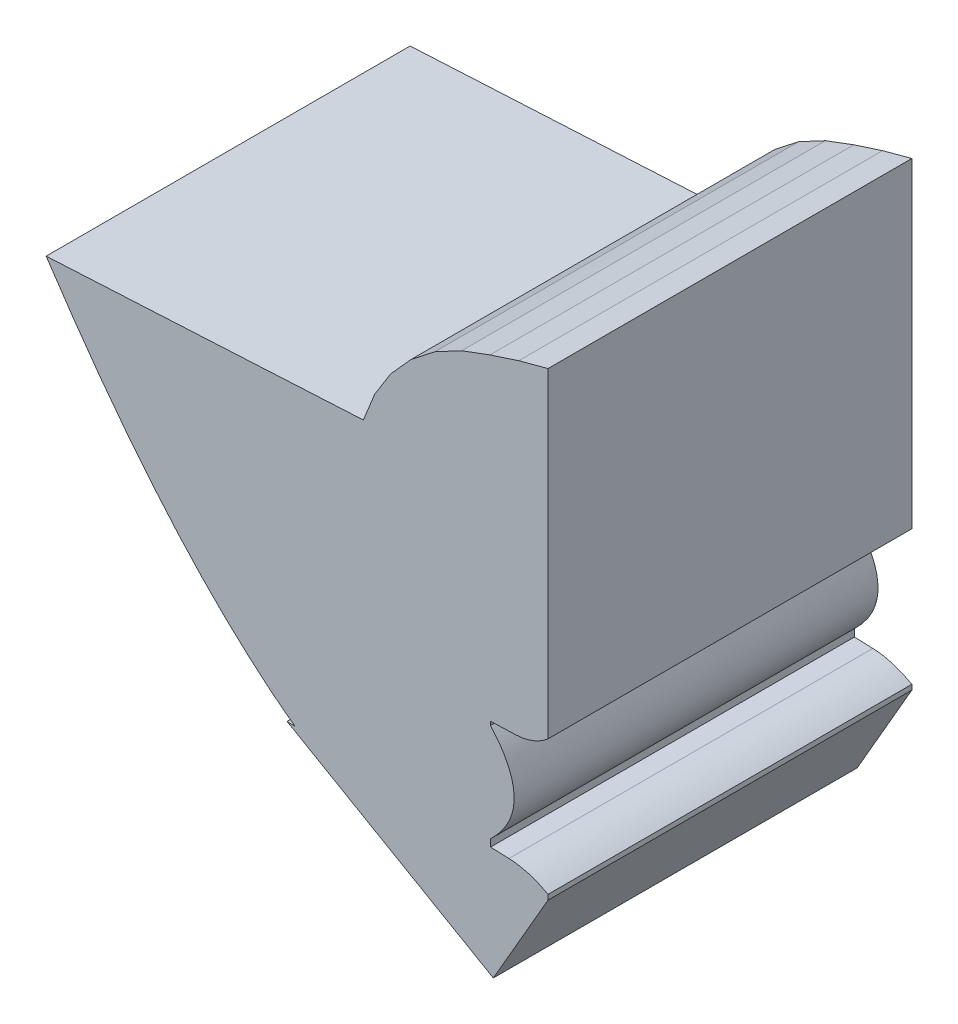
ISO-10303-21;
HEADER;
FILE_DESCRIPTION(('STEP AP214'),'2;1');
FILE_NAME('part.step','',(''),(''),'','','');
FILE_SCHEMA(('AUTOMOTIVE_DESIGN { 1 0 10303 214 1 1 1 1 }'));
ENDSEC;
DATA;
#1=APPLICATION_CONTEXT('core data for automotive mechanical design processes');
#2=APPLICATION_PROTOCOL_DEFINITION('international standard','automotive_design',2000,#1);
#3=PRODUCT_CONTEXT('',#1,'mechanical');
#4=PRODUCT('Part','Part','',(#3));
#5=PRODUCT_RELATED_PRODUCT_CATEGORY('part','',(#4));
#6=PRODUCT_DEFINITION_FORMATION('','',#4);
#7=PRODUCT_DEFINITION_CONTEXT('part definition',#1,'design');
#8=PRODUCT_DEFINITION('design','',#6,#7);
#9=PRODUCT_DEFINITION_SHAPE('','',#8);
#10=(LENGTH_UNIT() NAMED_UNIT(*) SI_UNIT(.MILLI.,.METRE.));
#11=(NAMED_UNIT(*) PLANE_ANGLE_UNIT() SI_UNIT($,.RADIAN.));
#12=(NAMED_UNIT(*) SI_UNIT($,.STERADIAN.) SOLID_ANGLE_UNIT());
#13=UNCERTAINTY_MEASURE_WITH_UNIT(LENGTH_MEASURE(1.E-05),#10,'distance_accuracy_value','');
#14=(GEOMETRIC_REPRESENTATION_CONTEXT(3) GLOBAL_UNCERTAINTY_ASSIGNED_CONTEXT((#13)) GLOBAL_UNIT_ASSIGNED_CONTEXT((#10,
#11,#12)) REPRESENTATION_CONTEXT('',''));
#15=CARTESIAN_POINT('',(0.,0.,0.));
#16=DIRECTION('',(0.,0.,1.));
#17=DIRECTION('',(1.,0.,0.));
#18=AXIS2_PLACEMENT_3D('',#15,#16,#17);
#19=CARTESIAN_POINT('',(-2.17733041778456,0.,7.21));
#20=DIRECTION('',(1.,0.,0.));
#21=DIRECTION('',(0.,1.,0.));
#22=AXIS2_PLACEMENT_3D('',#19,#20,#21);
#23=PLANE('',#22);
#24=DIRECTION('',(0.,1.,0.));
#25=VECTOR('',#24,1.);
#26=CARTESIAN_POINT('',(-2.17733041778456,0.,7.21));
#27=LINE('',#26,#25);
#28=CARTESIAN_POINT('',(-2.17733041779455,-1.68817652024789,7.21));
#29=VERTEX_POINT('',#28);
#30=CARTESIAN_POINT('',(-2.17733041778456,-1.97588987280662,7.21));
#31=VERTEX_POINT('',#30);
#32=EDGE_CURVE('E569',#29,#31,#27,.F.);
#33=ORIENTED_EDGE('',*,*,#32,.T.);
#34=DIRECTION('',(0.,0.,-1.));
#35=VECTOR('',#34,1.);
#36=CARTESIAN_POINT('',(-2.17733041778456,-1.97588987280662,7.21));
#37=LINE('',#36,#35);
#38=CARTESIAN_POINT('',(-2.17733041778456,-1.97588987280662,-7.21));
#39=VERTEX_POINT('',#38);
#40=EDGE_CURVE('E264',#31,#39,#37,.T.);
#41=ORIENTED_EDGE('',*,*,#40,.T.);
#42=DIRECTION('',(0.,1.,0.));
#43=VECTOR('',#42,1.);
#44=CARTESIAN_POINT('',(-2.17733041778456,0.,-7.21));
#45=LINE('',#44,#43);
#46=CARTESIAN_POINT('',(-2.17733041778456,-1.68817652020115,-7.21));
#47=VERTEX_POINT('',#46);
#48=EDGE_CURVE('E555',#47,#39,#45,.F.);
#49=ORIENTED_EDGE('',*,*,#48,.F.);
#50=DIRECTION('',(0.,0.,-1.));
#51=VECTOR('',#50,1.);
#52=CARTESIAN_POINT('',(-2.17733041778328,-1.68817652023794,30.8299178698776));
#53=LINE('',#52,#51);
#54=EDGE_CURVE('E607',#29,#47,#53,.T.);
#55=ORIENTED_EDGE('',*,*,#54,.F.);
#56=EDGE_LOOP('',(#33,#41,#49,#55));
#57=FACE_BOUND('',#56,.T.);
#58=ADVANCED_FACE('F59',(#57),#23,.T.);
#59=CARTESIAN_POINT('',(-82931.1005830976,996560.072871644,30.8299178698776));
#60=CARTESIAN_POINT('',(87153.8887538027,-996199.093812144,30.8299178698776));
#61=CARTESIAN_POINT('',(-91384.0928999308,995820.531871049,30.8299178698776));
#62=B_SPLINE_CURVE_WITH_KNOTS('',2,(#59,#60,#61),.UNSPECIFIED.,.F.,.F.,(3,3),(0.,1.),.UNSPECIFIED.);
#63=DIRECTION('',(0.,0.,-1.));
#64=VECTOR('',#63,1.);
#65=SURFACE_OF_LINEAR_EXTRUSION('',#62,#64);
#66=CARTESIAN_POINT('',(-10.336006015881,-1.39847805226411,-7.21));
#67=CARTESIAN_POINT('',(-10.1291599859094,-1.55603538818634,-7.21));
#68=CARTESIAN_POINT('',(-9.92303036904074,-1.70540408487196,-7.21));
#69=B_SPLINE_CURVE_WITH_KNOTS('',2,(#66,#67,#68),.UNSPECIFIED.,.F.,.F.,(3,3),(0.500919693117118,
0.500965025000237),.UNSPECIFIED.);
#70=CARTESIAN_POINT('',(-10.3360060158632,-1.39847805228234,-7.2125366176972));
#71=VERTEX_POINT('',#70);
#72=CARTESIAN_POINT('',(-9.92303036848693,-1.70540407027587,-7.21));
#73=VERTEX_POINT('',#72);
#74=EDGE_CURVE('E68',#71,#73,#69,.T.);
#75=ORIENTED_EDGE('',*,*,#74,.T.);
#76=DIRECTION('',(0.,0.,-1.));
#77=VECTOR('',#76,1.);
#78=CARTESIAN_POINT('',(-9.92303039022491,-1.70540406951669,0.));
#79=LINE('',#78,#77);
#80=CARTESIAN_POINT('',(-9.92303039006936,-1.70540406964987,7.21));
#81=VERTEX_POINT('',#80);
#82=EDGE_CURVE('E13',#73,#81,#79,.F.);
#83=ORIENTED_EDGE('',*,*,#82,.T.);
#84=CARTESIAN_POINT('',(-9.92303039006748,-1.70540406963493,7.21));
#85=CARTESIAN_POINT('',(-10.129159996459,-1.55603538015025,7.21));
#86=CARTESIAN_POINT('',(-10.3360060158804,-1.39847805226429,7.21));
#87=B_SPLINE_CURVE_WITH_KNOTS('',2,(#84,#85,#86),.UNSPECIFIED.,.F.,.F.,(3,3),(0.50091969311943,
0.500965025000236),.UNSPECIFIED.);
#88=CARTESIAN_POINT('',(-10.3360060158816,-1.39847805227263,7.21251805157951));
#89=VERTEX_POINT('',#88);
#90=EDGE_CURVE('E543',#89,#81,#87,.F.);
#91=ORIENTED_EDGE('',*,*,#90,.F.);
#92=CARTESIAN_POINT('',(-10.336006015861,-1.39847805228632,7.21));
#93=CARTESIAN_POINT('',(-10.6228848167366,-1.17995870432205,7.21));
#94=CARTESIAN_POINT('',(-10.9111416710362,-0.945688133646021,7.21));
#95=B_SPLINE_CURVE_WITH_KNOTS('',2,(#92,#93,#94),.UNSPECIFIED.,.F.,.F.,(3,3),(0.500965025000234,
0.501027896674745),.UNSPECIFIED.);
#96=CARTESIAN_POINT('',(-10.9111416711035,-0.945688133586594,7.21251805157951));
#97=VERTEX_POINT('',#96);
#98=EDGE_CURVE('E478',#97,#89,#95,.F.);
#99=ORIENTED_EDGE('',*,*,#98,.F.);
#100=CARTESIAN_POINT('',(-10.9111416711694,-0.945688133531575,7.21));
#101=CARTESIAN_POINT('',(-15.1971813204195,2.53763911301365,7.21));
#102=CARTESIAN_POINT('',(-19.7878835648669,9.50327575735757,7.21));
#103=B_SPLINE_CURVE_WITH_KNOTS('',2,(#100,#101,#102),.UNSPECIFIED.,.F.,.F.,(3,3),
(0.501027896674761,0.501962724366634),.UNSPECIFIED.);
#104=CARTESIAN_POINT('',(-19.7878835648708,9.50327575735899,7.21251805157951));
#105=VERTEX_POINT('',#104);
#106=EDGE_CURVE('E528',#105,#97,#103,.F.);
#107=ORIENTED_EDGE('',*,*,#106,.F.);
#108=DIRECTION('',(0.,0.,1.));
#109=VECTOR('',#108,1.);
#110=CARTESIAN_POINT('',(-19.7878835648708,9.50327575735899,-7.21507323539439));
#111=LINE('',#110,#109);
#112=CARTESIAN_POINT('',(-19.7878835648708,9.50327575735899,-7.21253661769719));
#113=VERTEX_POINT('',#112);
#114=EDGE_CURVE('E382',#113,#105,#111,.T.);
#115=ORIENTED_EDGE('',*,*,#114,.F.);
#116=CARTESIAN_POINT('',(-19.7878835648714,9.50327575734023,-7.21));
#117=CARTESIAN_POINT('',(-15.197181319061,2.53763911092818,-7.21));
#118=CARTESIAN_POINT('',(-10.9111416686287,-0.945688135617351,-7.21));
#119=B_SPLINE_CURVE_WITH_KNOTS('',2,(#116,#117,#118),.UNSPECIFIED.,.F.,.F.,(3,3),
(0.501027896674483,0.501962724366634),.UNSPECIFIED.);
#120=CARTESIAN_POINT('',(-10.9111416684846,-0.945688135711886,-7.21253661769719));
#121=VERTEX_POINT('',#120);
#122=EDGE_CURVE('E519',#113,#121,#119,.T.);
#123=ORIENTED_EDGE('',*,*,#122,.T.);
#124=CARTESIAN_POINT('',(-10.9111416684921,-0.945688135713634,-7.21));
#125=CARTESIAN_POINT('',(-10.6228848154707,-1.17995870528634,-7.21));
#126=CARTESIAN_POINT('',(-10.336006015861,-1.39847805228632,-7.21));
#127=B_SPLINE_CURVE_WITH_KNOTS('',2,(#124,#125,#126),.UNSPECIFIED.,.F.,.F.,(3,3),
(0.500965025000234,0.501027896674468),.UNSPECIFIED.);
#128=EDGE_CURVE('E465',#121,#71,#127,.T.);
#129=ORIENTED_EDGE('',*,*,#128,.T.);
#130=EDGE_LOOP('',(#75,#83,#91,#99,#107,#115,#123,#129));
#131=FACE_BOUND('',#130,.T.);
#132=ADVANCED_FACE('F432',(#131),#65,.T.);
#133=DIRECTION('',(0.,1.,0.));
#134=VECTOR('',#133,1.);
#135=CARTESIAN_POINT('',(-2.17733041778456,0.,-7.21));
#136=LINE('',#135,#134);
#137=CARTESIAN_POINT('',(-2.17733041778456,2.34248700715526,-7.21));
#138=VERTEX_POINT('',#137);
#139=CARTESIAN_POINT('',(-2.17733041777607,2.20172974209443,-7.21));
#140=VERTEX_POINT('',#139);
#141=EDGE_CURVE('E558',#138,#140,#136,.F.);
#142=ORIENTED_EDGE('',*,*,#141,.F.);
#143=DIRECTION('',(0.,0.,-1.));
#144=VECTOR('',#143,1.);
#145=CARTESIAN_POINT('',(-2.17733041778456,2.34248700715526,24.0565253000013));
#146=LINE('',#145,#144);
#147=CARTESIAN_POINT('',(-2.17733041778456,2.34248700715526,7.21));
#148=VERTEX_POINT('',#147);
#149=EDGE_CURVE('E371',#148,#138,#146,.T.);
#150=ORIENTED_EDGE('',*,*,#149,.F.);
#151=DIRECTION('',(0.,1.,0.));
#152=VECTOR('',#151,1.);
#153=CARTESIAN_POINT('',(-2.17733041778456,0.,7.21));
#154=LINE('',#153,#152);
#155=CARTESIAN_POINT('',(-2.17733041778074,2.20172974210003,7.21));
#156=VERTEX_POINT('',#155);
#157=EDGE_CURVE('E568',#148,#156,#154,.F.);
#158=ORIENTED_EDGE('',*,*,#157,.T.);
#159=DIRECTION('',(0.,0.,-1.));
#160=VECTOR('',#159,1.);
#161=CARTESIAN_POINT('',(-2.17733041778074,2.20172974210003,30.8299178698776));
#162=LINE('',#161,#160);
#163=EDGE_CURVE('E641',#156,#140,#162,.T.);
#164=ORIENTED_EDGE('',*,*,#163,.T.);
#165=EDGE_LOOP('',(#142,#150,#158,#164));
#166=FACE_BOUND('',#165,.T.);
#167=ADVANCED_FACE('F437',(#166),#23,.T.);
#168=CARTESIAN_POINT('',(0.,0.,7.21));
#169=DIRECTION('',(0.,0.,1.));
#170=DIRECTION('',(1.,0.,0.));
#171=AXIS2_PLACEMENT_3D('',#168,#169,#170);
#172=PLANE('',#171);
#173=ORIENTED_EDGE('',*,*,#90,.T.);
#174=DIRECTION('',(-0.999390827019096,0.0348994967025043,0.));
#175=VECTOR('',#174,1.);
#176=CARTESIAN_POINT('',(-1.44765075676889,-2.00137084805176,7.21));
#177=LINE('',#176,#175);
#178=CARTESIAN_POINT('',(-10.2430298512047,-1.69422944210241,7.21));
#179=VERTEX_POINT('',#178);
#180=EDGE_CURVE('E75',#81,#179,#177,.T.);
#181=ORIENTED_EDGE('',*,*,#180,.T.);
#182=DIRECTION('',(0.866025403784436,-0.500000000000004,0.));
#183=VECTOR('',#182,1.);
#184=CARTESIAN_POINT('',(-10.2430298512047,-1.69422944210241,7.21));
#185=LINE('',#184,#183);
#186=CARTESIAN_POINT('',(-2.06808136780512,-6.41403814960451,7.21));
#187=VERTEX_POINT('',#186);
#188=EDGE_CURVE('E225',#179,#187,#185,.T.);
#189=ORIENTED_EDGE('',*,*,#188,.T.);
#190=DIRECTION('',(0.500000000000803,0.866025403783975,0.));
#191=VECTOR('',#190,1.);
#192=CARTESIAN_POINT('',(0.100000000004221,-2.65881106562334,7.21));
#193=LINE('',#192,#191);
#194=CARTESIAN_POINT('',(0.100000000004221,-2.65881106562334,7.21));
#195=VERTEX_POINT('',#194);
#196=EDGE_CURVE('E260',#187,#195,#193,.T.);
#197=ORIENTED_EDGE('',*,*,#196,.T.);
#198=DIRECTION('',(-1.62011653008151E-11,1.,0.));
#199=VECTOR('',#198,1.);
#200=CARTESIAN_POINT('',(0.100000000000981,-2.45881106562334,7.21));
#201=LINE('',#200,#199);
#202=CARTESIAN_POINT('',(0.100000000000981,-2.45881106562334,7.21));
#203=VERTEX_POINT('',#202);
#204=EDGE_CURVE('E628',#195,#203,#201,.T.);
#205=ORIENTED_EDGE('',*,*,#204,.T.);
#206=CARTESIAN_POINT('',(-15004.7897636461,-999892.444646946,7.21));
#207=CARTESIAN_POINT('',(17450.906437277,999845.695156391,7.21));
#208=CARTESIAN_POINT('',(-19903.023110908,-999806.945665836,7.21));
#209=B_SPLINE_CURVE_WITH_KNOTS('',2,(#206,#207,#208),.UNSPECIFIED.,.F.,.F.,(3,3),(0.,1.),.UNSPECIFIED.);
#210=CARTESIAN_POINT('',(-1.44765075676889,-2.00137084805176,7.21));
#211=VERTEX_POINT('',#210);
#212=EDGE_CURVE('E268',#203,#211,#209,.T.);
#213=ORIENTED_EDGE('',*,*,#212,.T.);
#214=EDGE_CURVE('E267',#211,#31,#177,.T.);
#215=ORIENTED_EDGE('',*,*,#214,.T.);
#216=ORIENTED_EDGE('',*,*,#32,.F.);
#217=CARTESIAN_POINT('',(-2.17733041777607,2.20172974209443,7.21));
#218=CARTESIAN_POINT('',(-0.307419303310444,0.0931805865995528,7.21));
#219=CARTESIAN_POINT('',(-2.17733041779435,-1.68817652026,7.21));
#220=B_SPLINE_CURVE_WITH_KNOTS('',2,(#217,#218,#219),.UNSPECIFIED.,.F.,.F.,(3,3),
(0.49947186766891,0.500440643667569),.UNSPECIFIED.);
#221=EDGE_CURVE('E614',#156,#29,#220,.T.);
#222=ORIENTED_EDGE('',*,*,#221,.F.);
#223=ORIENTED_EDGE('',*,*,#157,.F.);
#224=DIRECTION('',(0.999390827019096,0.0348994967025048,0.));
#225=VECTOR('',#224,1.);
#226=CARTESIAN_POINT('',(-2.17733041778456,2.34248700715526,7.21));
#227=LINE('',#226,#225);
#228=CARTESIAN_POINT('',(-1.19050164048462,2.37694782742692,7.21000000000002));
#229=VERTEX_POINT('',#228);
#230=EDGE_CURVE('E78',#148,#229,#227,.T.);
#231=ORIENTED_EDGE('',*,*,#230,.T.);
#232=CARTESIAN_POINT('',(-343900.072311573,939011.080499257,7.21000000000001));
#233=CARTESIAN_POINT('',(342019.599581338,-939690.120785908,7.21000000000001));
#234=CARTESIAN_POINT('',(-340141.301828429,940379.16107256,7.21000000000001));
#235=B_SPLINE_CURVE_WITH_KNOTS('',2,(#232,#233,#234),.UNSPECIFIED.,.F.,.F.,(3,3),(0.,1.),.UNSPECIFIED.);
#236=CARTESIAN_POINT('',(0.100000000004221,2.87767341815847,7.21000000000001));
#237=VERTEX_POINT('',#236);
#238=EDGE_CURVE('E317',#229,#237,#235,.T.);
#239=ORIENTED_EDGE('',*,*,#238,.T.);
#240=DIRECTION('',(0.,1.,0.));
#241=VECTOR('',#240,1.);
#242=CARTESIAN_POINT('',(0.100000000004221,2.87767341815847,7.21));
#243=LINE('',#242,#241);
#244=CARTESIAN_POINT('',(0.100000000004747,15.587903347272,7.21));
#245=VERTEX_POINT('',#244);
#246=EDGE_CURVE('E347',#237,#245,#243,.T.);
#247=ORIENTED_EDGE('',*,*,#246,.T.);
#248=DIRECTION('',(-0.96592582628907,-0.258819045102515,0.));
#249=VECTOR('',#248,1.);
#250=CARTESIAN_POINT('',(-1.05911099154214,15.277320493149,7.21));
#251=LINE('',#250,#249);
#252=CARTESIAN_POINT('',(-1.05911099154214,15.277320493149,7.21000000000001));
#253=VERTEX_POINT('',#252);
#254=EDGE_CURVE('E350',#245,#253,#251,.T.);
#255=ORIENTED_EDGE('',*,*,#254,.T.);
#256=DIRECTION('',(-0.951056516295155,-0.309016994374943,0.));
#257=VECTOR('',#256,1.);
#258=CARTESIAN_POINT('',(-2.20037881109632,14.906500099899,7.21));
#259=LINE('',#258,#257);
#260=CARTESIAN_POINT('',(-2.20037881109632,14.906500099899,7.21000000000001));
#261=VERTEX_POINT('',#260);
#262=EDGE_CURVE('E343',#253,#261,#259,.T.);
#263=ORIENTED_EDGE('',*,*,#262,.T.);
#264=DIRECTION('',(-0.9366721892484,-0.350207381259461,0.));
#265=VECTOR('',#264,1.);
#266=CARTESIAN_POINT('',(-3.3243854381944,14.4862512423877,7.21));
#267=LINE('',#266,#265);
#268=CARTESIAN_POINT('',(-3.3243854381944,14.4862512423877,7.21000000000001));
#269=VERTEX_POINT('',#268);
#270=EDGE_CURVE('E341',#261,#269,#267,.T.);
#271=ORIENTED_EDGE('',*,*,#270,.T.);
#272=DIRECTION('',(-0.882947592859007,-0.46947156278574,0.));
#273=VECTOR('',#272,1.);
#274=CARTESIAN_POINT('',(-4.38392254962521,13.9228853670448,7.21));
#275=LINE('',#274,#273);
#276=CARTESIAN_POINT('',(-4.38392254962521,13.9228853670448,7.21000000000001));
#277=VERTEX_POINT('',#276);
#278=EDGE_CURVE('E336',#269,#277,#275,.T.);
#279=ORIENTED_EDGE('',*,*,#278,.T.);
#280=DIRECTION('',(-0.788010753606726,-0.615661475325654,0.));
#281=VECTOR('',#280,1.);
#282=CARTESIAN_POINT('',(-5.32953545395328,13.184091596654,7.21));
#283=LINE('',#282,#281);
#284=CARTESIAN_POINT('',(-5.32953545395328,13.184091596654,7.21000000000001));
#285=VERTEX_POINT('',#284);
#286=EDGE_CURVE('E333',#277,#285,#283,.T.);
#287=ORIENTED_EDGE('',*,*,#286,.T.);
#288=DIRECTION('',(-0.669130606358526,-0.743144825477694,0.));
#289=VECTOR('',#288,1.);
#290=CARTESIAN_POINT('',(-6.13249218158351,12.2923178060808,7.21));
#291=LINE('',#290,#289);
#292=CARTESIAN_POINT('',(-6.13249218158351,12.2923178060808,7.21000000000001));
#293=VERTEX_POINT('',#292);
#294=EDGE_CURVE('E334',#285,#293,#291,.T.);
#295=ORIENTED_EDGE('',*,*,#294,.T.);
#296=DIRECTION('',(-0.52991926423321,-0.848048096156423,0.));
#297=VECTOR('',#296,1.);
#298=CARTESIAN_POINT('',(-6.76839529866336,11.2746600906931,7.21));
#299=LINE('',#298,#297);
#300=CARTESIAN_POINT('',(-6.76839529866336,11.2746600906931,7.21000000000001));
#301=VERTEX_POINT('',#300);
#302=EDGE_CURVE('E329',#293,#301,#299,.T.);
#303=ORIENTED_EDGE('',*,*,#302,.T.);
#304=DIRECTION('',(-0.374606593415918,-0.927183854566785,0.));
#305=VECTOR('',#304,1.);
#306=CARTESIAN_POINT('',(-7.21792321076246,10.1620394652129,7.21));
#307=LINE('',#306,#305);
#308=CARTESIAN_POINT('',(-7.21792321076246,10.1620394652129,7.21000000000001));
#309=VERTEX_POINT('',#308);
#310=EDGE_CURVE('E328',#301,#309,#307,.T.);
#311=ORIENTED_EDGE('',*,*,#310,.T.);
#312=DIRECTION('',(-0.998629534754494,-0.0523359562444688,0.));
#313=VECTOR('',#312,1.);
#314=CARTESIAN_POINT('',(-10.3098203952063,10.,7.21));
#315=LINE('',#314,#313);
#316=EDGE_CURVE('E321',#309,#105,#315,.T.);
#317=ORIENTED_EDGE('',*,*,#316,.T.);
#318=ORIENTED_EDGE('',*,*,#106,.T.);
#319=ORIENTED_EDGE('',*,*,#98,.T.);
#320=EDGE_LOOP('',(#173,#181,#189,#197,#205,#213,#215,#216,#222,#223,#231,#239,#247,#255,#263,
#271,#279,#287,#295,#303,#311,#317,#318,#319));
#321=FACE_BOUND('',#320,.T.);
#322=ADVANCED_FACE('F498',(#321),#172,.T.);
#323=CARTESIAN_POINT('',(0.,0.,-7.21));
#324=DIRECTION('',(0.,0.,1.));
#325=DIRECTION('',(1.,0.,0.));
#326=AXIS2_PLACEMENT_3D('',#323,#324,#325);
#327=PLANE('',#326);
#328=ORIENTED_EDGE('',*,*,#48,.T.);
#329=DIRECTION('',(0.999390827019096,-0.0348994967025043,0.));
#330=VECTOR('',#329,1.);
#331=CARTESIAN_POINT('',(-1.44765075676889,-2.00137084805176,-7.21));
#332=LINE('',#331,#330);
#333=CARTESIAN_POINT('',(-1.44765075676889,-2.00137084805176,-7.21));
#334=VERTEX_POINT('',#333);
#335=EDGE_CURVE('E243',#39,#334,#332,.T.);
#336=ORIENTED_EDGE('',*,*,#335,.T.);
#337=CARTESIAN_POINT('',(-15004.7897636461,-999892.444646946,-7.21));
#338=CARTESIAN_POINT('',(17450.906437277,999845.695156391,-7.21));
#339=CARTESIAN_POINT('',(-19903.023110908,-999806.945665836,-7.21));
#340=B_SPLINE_CURVE_WITH_KNOTS('',2,(#337,#338,#339),.UNSPECIFIED.,.F.,.F.,(3,3),(0.,1.),.UNSPECIFIED.);
#341=CARTESIAN_POINT('',(0.100000000000981,-2.45881106562334,-7.21));
#342=VERTEX_POINT('',#341);
#343=EDGE_CURVE('E246',#334,#342,#340,.F.);
#344=ORIENTED_EDGE('',*,*,#343,.T.);
#345=DIRECTION('',(1.62011653008151E-11,-1.,0.));
#346=VECTOR('',#345,1.);
#347=CARTESIAN_POINT('',(0.100000000000981,-2.45881106562334,-7.21));
#348=LINE('',#347,#346);
#349=CARTESIAN_POINT('',(0.100000000004221,-2.65881106562334,-7.21));
#350=VERTEX_POINT('',#349);
#351=EDGE_CURVE('E636',#342,#350,#348,.T.);
#352=ORIENTED_EDGE('',*,*,#351,.T.);
#353=DIRECTION('',(-0.500000000000803,-0.866025403783975,0.));
#354=VECTOR('',#353,1.);
#355=CARTESIAN_POINT('',(0.100000000004221,-2.65881106562334,-7.21));
#356=LINE('',#355,#354);
#357=CARTESIAN_POINT('',(-2.06808136780512,-6.41403814960451,-7.21));
#358=VERTEX_POINT('',#357);
#359=EDGE_CURVE('E237',#350,#358,#356,.T.);
#360=ORIENTED_EDGE('',*,*,#359,.T.);
#361=DIRECTION('',(-0.866025403784436,0.500000000000004,0.));
#362=VECTOR('',#361,1.);
#363=CARTESIAN_POINT('',(-10.2430298512047,-1.69422944210241,-7.21));
#364=LINE('',#363,#362);
#365=CARTESIAN_POINT('',(-10.2430298512047,-1.69422944210241,-7.21));
#366=VERTEX_POINT('',#365);
#367=EDGE_CURVE('E224',#358,#366,#364,.T.);
#368=ORIENTED_EDGE('',*,*,#367,.T.);
#369=EDGE_CURVE('E232',#366,#73,#332,.T.);
#370=ORIENTED_EDGE('',*,*,#369,.T.);
#371=ORIENTED_EDGE('',*,*,#74,.F.);
#372=ORIENTED_EDGE('',*,*,#128,.F.);
#373=ORIENTED_EDGE('',*,*,#122,.F.);
#374=DIRECTION('',(-0.998629534754494,-0.0523359562444688,0.));
#375=VECTOR('',#374,1.);
#376=CARTESIAN_POINT('',(-0.550881453784725,10.5114443180936,-7.21));
#377=LINE('',#376,#375);
#378=CARTESIAN_POINT('',(-7.21792321076246,10.1620394652129,-7.21));
#379=VERTEX_POINT('',#378);
#380=EDGE_CURVE('E542',#379,#113,#377,.T.);
#381=ORIENTED_EDGE('',*,*,#380,.F.);
#382=DIRECTION('',(0.374606593415918,0.927183854566785,0.));
#383=VECTOR('',#382,1.);
#384=CARTESIAN_POINT('',(-7.21792321076246,10.1620394652129,-7.21));
#385=LINE('',#384,#383);
#386=CARTESIAN_POINT('',(-6.76839529866336,11.2746600906931,-7.21));
#387=VERTEX_POINT('',#386);
#388=EDGE_CURVE('E292',#379,#387,#385,.T.);
#389=ORIENTED_EDGE('',*,*,#388,.T.);
#390=DIRECTION('',(0.52991926423321,0.848048096156423,0.));
#391=VECTOR('',#390,1.);
#392=CARTESIAN_POINT('',(-6.76839529866336,11.2746600906931,-7.21));
#393=LINE('',#392,#391);
#394=CARTESIAN_POINT('',(-6.13249218158351,12.2923178060808,-7.21));
#395=VERTEX_POINT('',#394);
#396=EDGE_CURVE('E288',#387,#395,#393,.T.);
#397=ORIENTED_EDGE('',*,*,#396,.T.);
#398=DIRECTION('',(0.669130606358526,0.743144825477694,0.));
#399=VECTOR('',#398,1.);
#400=CARTESIAN_POINT('',(-6.13249218158351,12.2923178060808,-7.21));
#401=LINE('',#400,#399);
#402=CARTESIAN_POINT('',(-5.32953545395328,13.184091596654,-7.21));
#403=VERTEX_POINT('',#402);
#404=EDGE_CURVE('E286',#395,#403,#401,.T.);
#405=ORIENTED_EDGE('',*,*,#404,.T.);
#406=DIRECTION('',(0.788010753606726,0.615661475325654,0.));
#407=VECTOR('',#406,1.);
#408=CARTESIAN_POINT('',(-5.32953545395328,13.184091596654,-7.21));
#409=LINE('',#408,#407);
#410=CARTESIAN_POINT('',(-4.38392254962521,13.9228853670448,-7.21));
#411=VERTEX_POINT('',#410);
#412=EDGE_CURVE('E281',#403,#411,#409,.T.);
#413=ORIENTED_EDGE('',*,*,#412,.T.);
#414=DIRECTION('',(0.882947592859007,0.46947156278574,0.));
#415=VECTOR('',#414,1.);
#416=CARTESIAN_POINT('',(-4.38392254962521,13.9228853670448,-7.21));
#417=LINE('',#416,#415);
#418=CARTESIAN_POINT('',(-3.3243854381944,14.4862512423877,-7.21));
#419=VERTEX_POINT('',#418);
#420=EDGE_CURVE('E280',#411,#419,#417,.T.);
#421=ORIENTED_EDGE('',*,*,#420,.T.);
#422=DIRECTION('',(0.9366721892484,0.350207381259461,0.));
#423=VECTOR('',#422,1.);
#424=CARTESIAN_POINT('',(-3.3243854381944,14.4862512423877,-7.21));
#425=LINE('',#424,#423);
#426=CARTESIAN_POINT('',(-2.20037881109632,14.906500099899,-7.21000000000001));
#427=VERTEX_POINT('',#426);
#428=EDGE_CURVE('E277',#419,#427,#425,.T.);
#429=ORIENTED_EDGE('',*,*,#428,.T.);
#430=DIRECTION('',(0.951056516295155,0.309016994374943,0.));
#431=VECTOR('',#430,1.);
#432=CARTESIAN_POINT('',(-2.20037881109632,14.906500099899,-7.21));
#433=LINE('',#432,#431);
#434=CARTESIAN_POINT('',(-1.05911099154214,15.277320493149,-7.21));
#435=VERTEX_POINT('',#434);
#436=EDGE_CURVE('E315',#427,#435,#433,.T.);
#437=ORIENTED_EDGE('',*,*,#436,.T.);
#438=DIRECTION('',(0.96592582628907,0.258819045102515,0.));
#439=VECTOR('',#438,1.);
#440=CARTESIAN_POINT('',(-1.05911099154214,15.277320493149,-7.21));
#441=LINE('',#440,#439);
#442=CARTESIAN_POINT('',(0.100000000004747,15.587903347272,-7.21));
#443=VERTEX_POINT('',#442);
#444=EDGE_CURVE('E307',#435,#443,#441,.T.);
#445=ORIENTED_EDGE('',*,*,#444,.T.);
#446=DIRECTION('',(0.,-1.,0.));
#447=VECTOR('',#446,1.);
#448=CARTESIAN_POINT('',(0.100000000004221,2.87767341815847,-7.21));
#449=LINE('',#448,#447);
#450=CARTESIAN_POINT('',(0.0999999999995449,2.8776734181557,-7.21000000000001));
#451=VERTEX_POINT('',#450);
#452=EDGE_CURVE('E303',#443,#451,#449,.T.);
#453=ORIENTED_EDGE('',*,*,#452,.T.);
#454=CARTESIAN_POINT('',(-343900.072311573,939011.080499257,-7.21000000000001));
#455=CARTESIAN_POINT('',(342019.599581338,-939690.120785908,-7.21000000000001));
#456=CARTESIAN_POINT('',(-340141.301828429,940379.16107256,-7.21000000000001));
#457=B_SPLINE_CURVE_WITH_KNOTS('',2,(#454,#455,#456),.UNSPECIFIED.,.F.,.F.,(3,3),(0.,1.),.UNSPECIFIED.);
#458=CARTESIAN_POINT('',(-1.19050164048462,2.37694782741517,-7.21));
#459=VERTEX_POINT('',#458);
#460=EDGE_CURVE('E296',#451,#459,#457,.F.);
#461=ORIENTED_EDGE('',*,*,#460,.T.);
#462=DIRECTION('',(-0.999390827019096,-0.0348994967025048,0.));
#463=VECTOR('',#462,1.);
#464=CARTESIAN_POINT('',(-2.17733041778456,2.34248700715526,-7.21));
#465=LINE('',#464,#463);
#466=EDGE_CURVE('E294',#459,#138,#465,.T.);
#467=ORIENTED_EDGE('',*,*,#466,.T.);
#468=ORIENTED_EDGE('',*,*,#141,.T.);
#469=CARTESIAN_POINT('',(-2.17733041776379,-1.68817652023098,-7.21));
#470=CARTESIAN_POINT('',(-0.307419303328964,0.0931805866132554,-7.21));
#471=CARTESIAN_POINT('',(-2.17733041776824,2.20172974208621,-7.21));
#472=B_SPLINE_CURVE_WITH_KNOTS('',2,(#469,#470,#471),.UNSPECIFIED.,.F.,.F.,(3,3),
(0.499471867668912,0.500440643667561),.UNSPECIFIED.);
#473=EDGE_CURVE('E638',#47,#140,#472,.T.);
#474=ORIENTED_EDGE('',*,*,#473,.F.);
#475=EDGE_LOOP('',(#328,#336,#344,#352,#360,#368,#370,#371,#372,#373,#381,#389,#397,#405,#413,
#421,#429,#437,#445,#453,#461,#467,#468,#474));
#476=FACE_BOUND('',#475,.T.);
#477=ADVANCED_FACE('F234',(#476),#327,.F.);
#478=CARTESIAN_POINT('',(-996021.636606251,89148.1321438377,30.8299178698776));
#479=CARTESIAN_POINT('',(996193.448091746,-87155.7427476542,30.8299178698776));
#480=CARTESIAN_POINT('',(-996370.259577241,85163.3533514707,30.8299178698776));
#481=B_SPLINE_CURVE_WITH_KNOTS('',2,(#478,#479,#480),.UNSPECIFIED.,.F.,.F.,(3,3),(0.,1.),.UNSPECIFIED.);
#482=DIRECTION('',(0.,0.,-1.));
#483=VECTOR('',#482,1.);
#484=SURFACE_OF_LINEAR_EXTRUSION('',#481,#483);
#485=ORIENTED_EDGE('',*,*,#163,.F.);
#486=ORIENTED_EDGE('',*,*,#221,.T.);
#487=ORIENTED_EDGE('',*,*,#54,.T.);
#488=ORIENTED_EDGE('',*,*,#473,.T.);
#489=EDGE_LOOP('',(#485,#486,#487,#488));
#490=FACE_BOUND('',#489,.T.);
#491=ADVANCED_FACE('F435',(#490),#484,.T.);
#492=CARTESIAN_POINT('',(-19.7878835648708,9.50327575735899,-7.21507323539439));
#493=DIRECTION('',(-0.0523359562444688,0.998629534754494,0.));
#494=DIRECTION('',(-0.998629534754494,-0.0523359562444688,0.));
#495=AXIS2_PLACEMENT_3D('',#492,#493,#494);
#496=PLANE('',#495);
#497=ORIENTED_EDGE('',*,*,#316,.F.);
#498=DIRECTION('',(0.,0.,-1.));
#499=VECTOR('',#498,1.);
#500=CARTESIAN_POINT('',(-7.21792321076246,10.1620394652129,24.0565253000013));
#501=LINE('',#500,#499);
#502=EDGE_CURVE('E368',#309,#379,#501,.T.);
#503=ORIENTED_EDGE('',*,*,#502,.T.);
#504=ORIENTED_EDGE('',*,*,#380,.T.);
#505=ORIENTED_EDGE('',*,*,#114,.T.);
#506=EDGE_LOOP('',(#497,#503,#504,#505));
#507=FACE_BOUND('',#506,.T.);
#508=ADVANCED_FACE('F426',(#507),#496,.T.);
#509=CARTESIAN_POINT('',(-1.05911099154214,15.277320493149,24.0565253000013));
#510=DIRECTION('',(0.258819045102515,-0.96592582628907,0.));
#511=DIRECTION('',(0.96592582628907,0.258819045102515,0.));
#512=AXIS2_PLACEMENT_3D('',#509,#510,#511);
#513=PLANE('',#512);
#514=ORIENTED_EDGE('',*,*,#254,.F.);
#515=DIRECTION('',(0.,0.,-1.));
#516=VECTOR('',#515,1.);
#517=CARTESIAN_POINT('',(0.100000000004747,15.587903347272,24.0565253000013));
#518=LINE('',#517,#516);
#519=EDGE_CURVE('E314',#245,#443,#518,.T.);
#520=ORIENTED_EDGE('',*,*,#519,.T.);
#521=ORIENTED_EDGE('',*,*,#444,.F.);
#522=DIRECTION('',(0.,0.,-1.));
#523=VECTOR('',#522,1.);
#524=CARTESIAN_POINT('',(-1.05911099154214,15.277320493149,24.0565253000013));
#525=LINE('',#524,#523);
#526=EDGE_CURVE('E353',#253,#435,#525,.T.);
#527=ORIENTED_EDGE('',*,*,#526,.F.);
#528=EDGE_LOOP('',(#514,#520,#521,#527));
#529=FACE_BOUND('',#528,.T.);
#530=ADVANCED_FACE('F425',(#529),#513,.F.);
#531=CARTESIAN_POINT('',(-2.20037881109632,14.906500099899,24.0565253000013));
#532=DIRECTION('',(0.309016994374943,-0.951056516295155,0.));
#533=DIRECTION('',(0.951056516295155,0.309016994374943,0.));
#534=AXIS2_PLACEMENT_3D('',#531,#532,#533);
#535=PLANE('',#534);
#536=ORIENTED_EDGE('',*,*,#262,.F.);
#537=ORIENTED_EDGE('',*,*,#526,.T.);
#538=ORIENTED_EDGE('',*,*,#436,.F.);
#539=DIRECTION('',(0.,0.,-1.));
#540=VECTOR('',#539,1.);
#541=CARTESIAN_POINT('',(-2.20037881109632,14.906500099899,24.0565253000013));
#542=LINE('',#541,#540);
#543=EDGE_CURVE('E358',#261,#427,#542,.T.);
#544=ORIENTED_EDGE('',*,*,#543,.F.);
#545=EDGE_LOOP('',(#536,#537,#538,#544));
#546=FACE_BOUND('',#545,.T.);
#547=ADVANCED_FACE('F420',(#546),#535,.F.);
#548=CARTESIAN_POINT('',(-3.3243854381944,14.4862512423877,24.0565253000013));
#549=DIRECTION('',(0.350207381259461,-0.9366721892484,0.));
#550=DIRECTION('',(0.9366721892484,0.350207381259461,0.));
#551=AXIS2_PLACEMENT_3D('',#548,#549,#550);
#552=PLANE('',#551);
#553=ORIENTED_EDGE('',*,*,#270,.F.);
#554=ORIENTED_EDGE('',*,*,#543,.T.);
#555=ORIENTED_EDGE('',*,*,#428,.F.);
#556=DIRECTION('',(0.,0.,-1.));
#557=VECTOR('',#556,1.);
#558=CARTESIAN_POINT('',(-3.3243854381944,14.4862512423877,24.0565253000013));
#559=LINE('',#558,#557);
#560=EDGE_CURVE('E356',#269,#419,#559,.T.);
#561=ORIENTED_EDGE('',*,*,#560,.F.);
#562=EDGE_LOOP('',(#553,#554,#555,#561));
#563=FACE_BOUND('',#562,.T.);
#564=ADVANCED_FACE('F416',(#563),#552,.F.);
#565=CARTESIAN_POINT('',(-4.38392254962521,13.9228853670448,24.0565253000013));
#566=DIRECTION('',(0.46947156278574,-0.882947592859007,0.));
#567=DIRECTION('',(0.882947592859007,0.46947156278574,0.));
#568=AXIS2_PLACEMENT_3D('',#565,#566,#567);
#569=PLANE('',#568);
#570=ORIENTED_EDGE('',*,*,#278,.F.);
#571=ORIENTED_EDGE('',*,*,#560,.T.);
#572=ORIENTED_EDGE('',*,*,#420,.F.);
#573=DIRECTION('',(0.,0.,-1.));
#574=VECTOR('',#573,1.);
#575=CARTESIAN_POINT('',(-4.38392254962521,13.9228853670448,24.0565253000013));
#576=LINE('',#575,#574);
#577=EDGE_CURVE('E359',#277,#411,#576,.T.);
#578=ORIENTED_EDGE('',*,*,#577,.F.);
#579=EDGE_LOOP('',(#570,#571,#572,#578));
#580=FACE_BOUND('',#579,.T.);
#581=ADVANCED_FACE('F415',(#580),#569,.F.);
#582=CARTESIAN_POINT('',(-5.32953545395328,13.184091596654,24.0565253000013));
#583=DIRECTION('',(0.615661475325654,-0.788010753606726,0.));
#584=DIRECTION('',(0.788010753606726,0.615661475325654,0.));
#585=AXIS2_PLACEMENT_3D('',#582,#583,#584);
#586=PLANE('',#585);
#587=ORIENTED_EDGE('',*,*,#286,.F.);
#588=ORIENTED_EDGE('',*,*,#577,.T.);
#589=ORIENTED_EDGE('',*,*,#412,.F.);
#590=DIRECTION('',(0.,0.,-1.));
#591=VECTOR('',#590,1.);
#592=CARTESIAN_POINT('',(-5.32953545395328,13.184091596654,24.0565253000013));
#593=LINE('',#592,#591);
#594=EDGE_CURVE('E365',#285,#403,#593,.T.);
#595=ORIENTED_EDGE('',*,*,#594,.F.);
#596=EDGE_LOOP('',(#587,#588,#589,#595));
#597=FACE_BOUND('',#596,.T.);
#598=ADVANCED_FACE('F409',(#597),#586,.F.);
#599=CARTESIAN_POINT('',(-6.13249218158351,12.2923178060808,24.0565253000013));
#600=DIRECTION('',(0.743144825477693,-0.669130606358526,0.));
#601=DIRECTION('',(0.669130606358526,0.743144825477694,0.));
#602=AXIS2_PLACEMENT_3D('',#599,#600,#601);
#603=PLANE('',#602);
#604=ORIENTED_EDGE('',*,*,#294,.F.);
#605=ORIENTED_EDGE('',*,*,#594,.T.);
#606=ORIENTED_EDGE('',*,*,#404,.F.);
#607=DIRECTION('',(0.,0.,-1.));
#608=VECTOR('',#607,1.);
#609=CARTESIAN_POINT('',(-6.13249218158351,12.2923178060808,24.0565253000013));
#610=LINE('',#609,#608);
#611=EDGE_CURVE('E364',#293,#395,#610,.T.);
#612=ORIENTED_EDGE('',*,*,#611,.F.);
#613=EDGE_LOOP('',(#604,#605,#606,#612));
#614=FACE_BOUND('',#613,.T.);
#615=ADVANCED_FACE('F404',(#614),#603,.F.);
#616=CARTESIAN_POINT('',(-6.76839529866336,11.2746600906931,24.0565253000013));
#617=DIRECTION('',(0.848048096156423,-0.52991926423321,0.));
#618=DIRECTION('',(0.52991926423321,0.848048096156423,0.));
#619=AXIS2_PLACEMENT_3D('',#616,#617,#618);
#620=PLANE('',#619);
#621=ORIENTED_EDGE('',*,*,#302,.F.);
#622=ORIENTED_EDGE('',*,*,#611,.T.);
#623=ORIENTED_EDGE('',*,*,#396,.F.);
#624=DIRECTION('',(0.,0.,-1.));
#625=VECTOR('',#624,1.);
#626=CARTESIAN_POINT('',(-6.76839529866336,11.2746600906931,24.0565253000013));
#627=LINE('',#626,#625);
#628=EDGE_CURVE('E366',#301,#387,#627,.T.);
#629=ORIENTED_EDGE('',*,*,#628,.F.);
#630=EDGE_LOOP('',(#621,#622,#623,#629));
#631=FACE_BOUND('',#630,.T.);
#632=ADVANCED_FACE('F398',(#631),#620,.F.);
#633=CARTESIAN_POINT('',(-7.21792321076246,10.1620394652129,24.0565253000013));
#634=DIRECTION('',(0.927183854566785,-0.374606593415918,0.));
#635=DIRECTION('',(0.374606593415918,0.927183854566785,0.));
#636=AXIS2_PLACEMENT_3D('',#633,#634,#635);
#637=PLANE('',#636);
#638=ORIENTED_EDGE('',*,*,#310,.F.);
#639=ORIENTED_EDGE('',*,*,#628,.T.);
#640=ORIENTED_EDGE('',*,*,#388,.F.);
#641=ORIENTED_EDGE('',*,*,#502,.F.);
#642=EDGE_LOOP('',(#638,#639,#640,#641));
#643=FACE_BOUND('',#642,.T.);
#644=ADVANCED_FACE('F399',(#643),#637,.F.);
#645=CARTESIAN_POINT('',(-2.17733041778456,2.34248700715526,24.0565253000013));
#646=DIRECTION('',(-0.0348994967025048,0.999390827019096,0.));
#647=DIRECTION('',(-0.999390827019096,-0.0348994967025048,0.));
#648=AXIS2_PLACEMENT_3D('',#645,#646,#647);
#649=PLANE('',#648);
#650=ORIENTED_EDGE('',*,*,#230,.F.);
#651=ORIENTED_EDGE('',*,*,#149,.T.);
#652=ORIENTED_EDGE('',*,*,#466,.F.);
#653=DIRECTION('',(0.,0.,-1.));
#654=VECTOR('',#653,1.);
#655=CARTESIAN_POINT('',(-1.19050164048462,2.37694782742692,24.0565253000013));
#656=LINE('',#655,#654);
#657=EDGE_CURVE('E373',#229,#459,#656,.T.);
#658=ORIENTED_EDGE('',*,*,#657,.F.);
#659=EDGE_LOOP('',(#650,#651,#652,#658));
#660=FACE_BOUND('',#659,.T.);
#661=ADVANCED_FACE('F395',(#660),#649,.F.);
#662=CARTESIAN_POINT('',(-343900.072311573,939011.080499257,24.0565253000013));
#663=CARTESIAN_POINT('',(342019.599581338,-939690.120785908,24.0565253000013));
#664=CARTESIAN_POINT('',(-340141.301828429,940379.16107256,24.0565253000013));
#665=B_SPLINE_CURVE_WITH_KNOTS('',2,(#662,#663,#664),.UNSPECIFIED.,.F.,.F.,(3,3),(0.,1.),.UNSPECIFIED.);
#666=DIRECTION('',(0.,0.,-1.));
#667=VECTOR('',#666,1.);
#668=SURFACE_OF_LINEAR_EXTRUSION('',#665,#667);
#669=ORIENTED_EDGE('',*,*,#238,.F.);
#670=ORIENTED_EDGE('',*,*,#657,.T.);
#671=ORIENTED_EDGE('',*,*,#460,.F.);
#672=DIRECTION('',(0.,0.,-1.));
#673=VECTOR('',#672,1.);
#674=CARTESIAN_POINT('',(0.100000000004221,2.87767341815847,24.0565253000013));
#675=LINE('',#674,#673);
#676=EDGE_CURVE('E354',#237,#451,#675,.T.);
#677=ORIENTED_EDGE('',*,*,#676,.F.);
#678=EDGE_LOOP('',(#669,#670,#671,#677));
#679=FACE_BOUND('',#678,.T.);
#680=ADVANCED_FACE('F387',(#679),#668,.F.);
#681=CARTESIAN_POINT('',(0.100000000004221,2.87767341815847,24.0565253000013));
#682=DIRECTION('',(-1.,0.,0.));
#683=DIRECTION('',(0.,-1.,0.));
#684=AXIS2_PLACEMENT_3D('',#681,#682,#683);
#685=PLANE('',#684);
#686=ORIENTED_EDGE('',*,*,#246,.F.);
#687=ORIENTED_EDGE('',*,*,#676,.T.);
#688=ORIENTED_EDGE('',*,*,#452,.F.);
#689=ORIENTED_EDGE('',*,*,#519,.F.);
#690=EDGE_LOOP('',(#686,#687,#688,#689));
#691=FACE_BOUND('',#690,.T.);
#692=ADVANCED_FACE('F393',(#691),#685,.F.);
#693=CARTESIAN_POINT('',(-1.44765075676889,-2.00137084805176,18.5790307739231));
#694=DIRECTION('',(-0.0348994967025043,-0.999390827019096,0.));
#695=DIRECTION('',(0.999390827019096,-0.0348994967025043,0.));
#696=AXIS2_PLACEMENT_3D('',#693,#694,#695);
#697=PLANE('',#696);
#698=ORIENTED_EDGE('',*,*,#40,.F.);
#699=ORIENTED_EDGE('',*,*,#214,.F.);
#700=DIRECTION('',(0.,0.,-1.));
#701=VECTOR('',#700,1.);
#702=CARTESIAN_POINT('',(-1.44765075676889,-2.00137084805176,18.5790307739231));
#703=LINE('',#702,#701);
#704=EDGE_CURVE('E226',#211,#334,#703,.T.);
#705=ORIENTED_EDGE('',*,*,#704,.T.);
#706=ORIENTED_EDGE('',*,*,#335,.F.);
#707=EDGE_LOOP('',(#698,#699,#705,#706));
#708=FACE_BOUND('',#707,.T.);
#709=ADVANCED_FACE('F625',(#708),#697,.F.);
#710=CARTESIAN_POINT('',(-15004.7897636461,-999892.444646946,18.5790307739231));
#711=CARTESIAN_POINT('',(17450.906437277,999845.695156391,18.5790307739231));
#712=CARTESIAN_POINT('',(-19903.023110908,-999806.945665836,18.5790307739231));
#713=B_SPLINE_CURVE_WITH_KNOTS('',2,(#710,#711,#712),.UNSPECIFIED.,.F.,.F.,(3,3),(0.,1.),.UNSPECIFIED.);
#714=DIRECTION('',(0.,0.,-1.));
#715=VECTOR('',#714,1.);
#716=SURFACE_OF_LINEAR_EXTRUSION('',#713,#715);
#717=ORIENTED_EDGE('',*,*,#212,.F.);
#718=DIRECTION('',(0.,0.,-1.));
#719=VECTOR('',#718,1.);
#720=CARTESIAN_POINT('',(0.100000000000981,-2.45881106562334,18.5790307739231));
#721=LINE('',#720,#719);
#722=EDGE_CURVE('E245',#203,#342,#721,.T.);
#723=ORIENTED_EDGE('',*,*,#722,.T.);
#724=ORIENTED_EDGE('',*,*,#343,.F.);
#725=ORIENTED_EDGE('',*,*,#704,.F.);
#726=EDGE_LOOP('',(#717,#723,#724,#725));
#727=FACE_BOUND('',#726,.T.);
#728=ADVANCED_FACE('F622',(#727),#716,.F.);
#729=ORIENTED_EDGE('',*,*,#82,.F.);
#730=ORIENTED_EDGE('',*,*,#369,.F.);
#731=DIRECTION('',(0.,0.,-1.));
#732=VECTOR('',#731,1.);
#733=CARTESIAN_POINT('',(-10.2430298512047,-1.69422944210241,18.5790307739231));
#734=LINE('',#733,#732);
#735=EDGE_CURVE('E219',#179,#366,#734,.T.);
#736=ORIENTED_EDGE('',*,*,#735,.F.);
#737=ORIENTED_EDGE('',*,*,#180,.F.);
#738=EDGE_LOOP('',(#729,#730,#736,#737));
#739=FACE_BOUND('',#738,.T.);
#740=ADVANCED_FACE('F241',(#739),#697,.F.);
#741=CARTESIAN_POINT('',(-10.2430298512047,-1.69422944210241,18.5790307739231));
#742=DIRECTION('',(0.500000000000004,0.866025403784436,0.));
#743=DIRECTION('',(-0.866025403784436,0.500000000000004,0.));
#744=AXIS2_PLACEMENT_3D('',#741,#742,#743);
#745=PLANE('',#744);
#746=ORIENTED_EDGE('',*,*,#188,.F.);
#747=ORIENTED_EDGE('',*,*,#735,.T.);
#748=ORIENTED_EDGE('',*,*,#367,.F.);
#749=DIRECTION('',(0.,0.,-1.));
#750=VECTOR('',#749,1.);
#751=CARTESIAN_POINT('',(-2.06808136780512,-6.41403814960451,18.5790307739231));
#752=LINE('',#751,#750);
#753=EDGE_CURVE('E227',#187,#358,#752,.T.);
#754=ORIENTED_EDGE('',*,*,#753,.F.);
#755=EDGE_LOOP('',(#746,#747,#748,#754));
#756=FACE_BOUND('',#755,.T.);
#757=ADVANCED_FACE('F221',(#756),#745,.F.);
#758=CARTESIAN_POINT('',(0.100000000004221,-2.65881106562334,18.5790307739231));
#759=DIRECTION('',(-0.866025403783975,0.500000000000802,0.));
#760=DIRECTION('',(-0.500000000000803,-0.866025403783975,0.));
#761=AXIS2_PLACEMENT_3D('',#758,#759,#760);
#762=PLANE('',#761);
#763=ORIENTED_EDGE('',*,*,#196,.F.);
#764=ORIENTED_EDGE('',*,*,#753,.T.);
#765=ORIENTED_EDGE('',*,*,#359,.F.);
#766=DIRECTION('',(0.,0.,-1.));
#767=VECTOR('',#766,1.);
#768=CARTESIAN_POINT('',(0.100000000004221,-2.65881106562334,18.5790307739231));
#769=LINE('',#768,#767);
#770=EDGE_CURVE('E631',#195,#350,#769,.T.);
#771=ORIENTED_EDGE('',*,*,#770,.F.);
#772=EDGE_LOOP('',(#763,#764,#765,#771));
#773=FACE_BOUND('',#772,.T.);
#774=ADVANCED_FACE('F751',(#773),#762,.F.);
#775=CARTESIAN_POINT('',(0.100000000000981,-2.45881106562334,18.5790307739231));
#776=DIRECTION('',(-1.,-1.62011653008151E-11,0.));
#777=DIRECTION('',(1.62011653008151E-11,-1.,0.));
#778=AXIS2_PLACEMENT_3D('',#775,#776,#777);
#779=PLANE('',#778);
#780=ORIENTED_EDGE('',*,*,#204,.F.);
#781=ORIENTED_EDGE('',*,*,#770,.T.);
#782=ORIENTED_EDGE('',*,*,#351,.F.);
#783=ORIENTED_EDGE('',*,*,#722,.F.);
#784=EDGE_LOOP('',(#780,#781,#782,#783));
#785=FACE_BOUND('',#784,.T.);
#786=ADVANCED_FACE('F634',(#785),#779,.F.);
#787=CLOSED_SHELL('',(#58,#132,#167,#322,#477,#491,#508,#530,#547,#564,#581,#598,#615,#632,#644,
#661,#680,#692,#709,#728,#740,#757,#774,#786));
#788=MANIFOLD_SOLID_BREP('B2',#787);
#789=ADVANCED_BREP_SHAPE_REPRESENTATION('',(#18,#788),#14);
#790=SHAPE_DEFINITION_REPRESENTATION(#9,#789);
ENDSEC;
END-ISO-10303-21;
